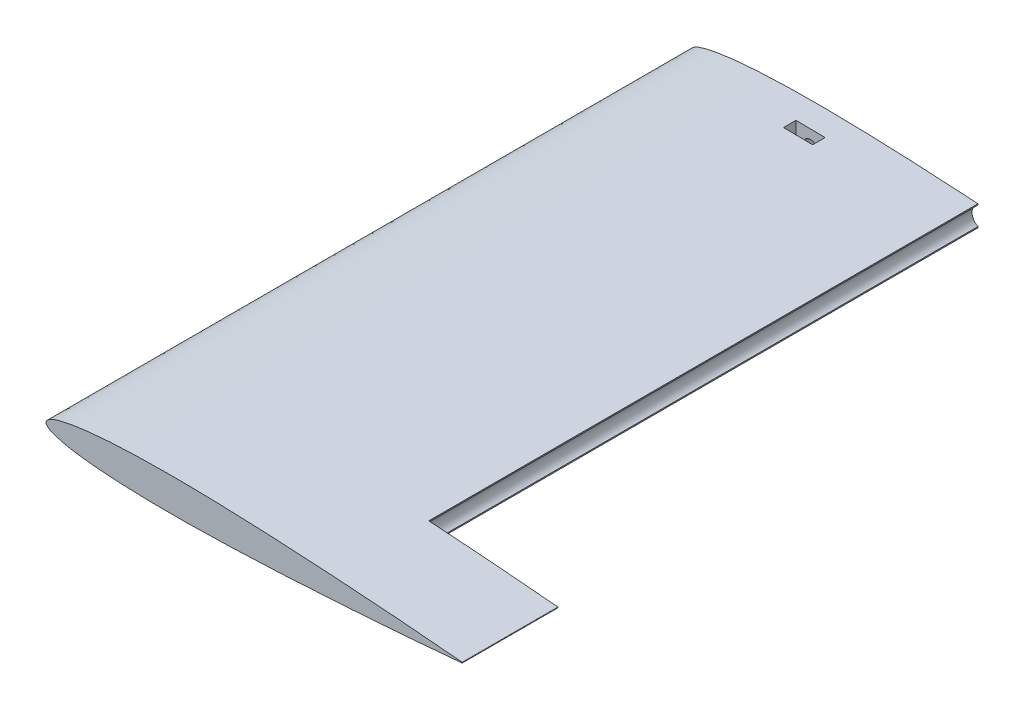
ISO-10303-21;
HEADER;
FILE_DESCRIPTION(('STEP AP214'),'2;1');
FILE_NAME('part.step','',(''),(''),'','','');
FILE_SCHEMA(('AUTOMOTIVE_DESIGN { 1 0 10303 214 1 1 1 1 }'));
ENDSEC;
DATA;
#1=APPLICATION_CONTEXT('core data for automotive mechanical design processes');
#2=APPLICATION_PROTOCOL_DEFINITION('international standard','automotive_design',2000,#1);
#3=PRODUCT_CONTEXT('',#1,'mechanical');
#4=PRODUCT('Part','Part','',(#3));
#5=PRODUCT_RELATED_PRODUCT_CATEGORY('part','',(#4));
#6=PRODUCT_DEFINITION_FORMATION('','',#4);
#7=PRODUCT_DEFINITION_CONTEXT('part definition',#1,'design');
#8=PRODUCT_DEFINITION('design','',#6,#7);
#9=PRODUCT_DEFINITION_SHAPE('','',#8);
#10=(LENGTH_UNIT() NAMED_UNIT(*) SI_UNIT(.MILLI.,.METRE.));
#11=(NAMED_UNIT(*) PLANE_ANGLE_UNIT() SI_UNIT($,.RADIAN.));
#12=(NAMED_UNIT(*) SI_UNIT($,.STERADIAN.) SOLID_ANGLE_UNIT());
#13=UNCERTAINTY_MEASURE_WITH_UNIT(LENGTH_MEASURE(1.E-05),#10,'distance_accuracy_value','');
#14=(GEOMETRIC_REPRESENTATION_CONTEXT(3) GLOBAL_UNCERTAINTY_ASSIGNED_CONTEXT((#13)) GLOBAL_UNIT_ASSIGNED_CONTEXT((#10,
#11,#12)) REPRESENTATION_CONTEXT('',''));
#15=CARTESIAN_POINT('',(0.,0.,0.));
#16=DIRECTION('',(0.,0.,1.));
#17=DIRECTION('',(1.,0.,0.));
#18=AXIS2_PLACEMENT_3D('',#15,#16,#17);
#19=CARTESIAN_POINT('',(100.,0.084,132.));
#20=CARTESIAN_POINT('',(98.333488814933,0.236746480055364,132.));
#21=CARTESIAN_POINT('',(95.0011947254255,0.542172688557606,132.));
#22=CARTESIAN_POINT('',(88.3355596211879,1.11089898015662,132.));
#23=CARTESIAN_POINT('',(80.0032933562199,1.76361099520967,132.));
#24=CARTESIAN_POINT('',(70.0029989334555,2.45786169254404,132.));
#25=CARTESIAN_POINT('',(60.0031046254057,3.06174772348002,132.));
#26=CARTESIAN_POINT('',(50.0030086005351,3.55213921170033,132.));
#27=CARTESIAN_POINT('',(40.0025985576922,3.90294649372571,132.));
#28=CARTESIAN_POINT('',(31.666961485844,4.02526015065941,132.));
#29=CARTESIAN_POINT('',(24.9991546003269,3.97693379087482,132.));
#30=CARTESIAN_POINT('',(19.9977755867835,3.84497639830756,132.));
#31=CARTESIAN_POINT('',(14.9933631314586,3.59248695861782,132.));
#32=CARTESIAN_POINT('',(10.8271840648808,3.23765157891607,132.));
#33=CARTESIAN_POINT('',(7.48905438800269,2.81402136675529,132.));
#34=CARTESIAN_POINT('',(4.99359465012965,2.40367305928858,132.));
#35=CARTESIAN_POINT('',(2.84962633983361,1.86792549429032,132.));
#36=CARTESIAN_POINT('',(1.16541350274339,1.32098725183071,132.));
#37=CARTESIAN_POINT('',(-0.664613784127027,0.,132.));
#38=CARTESIAN_POINT('',(1.16541350274339,-1.32098725183071,132.));
#39=CARTESIAN_POINT('',(2.84962633983362,-1.86792549429032,132.));
#40=CARTESIAN_POINT('',(4.99359465012963,-2.40367305928857,132.));
#41=CARTESIAN_POINT('',(7.48905438800269,-2.81402136675529,132.));
#42=CARTESIAN_POINT('',(10.8271840648809,-3.23765157891607,132.));
#43=CARTESIAN_POINT('',(14.9933631314586,-3.59248695861782,132.));
#44=CARTESIAN_POINT('',(19.9977755867835,-3.84497639830756,132.));
#45=CARTESIAN_POINT('',(24.9991546003269,-3.97693379087482,132.));
#46=CARTESIAN_POINT('',(31.666961485844,-4.02526015065941,132.));
#47=CARTESIAN_POINT('',(40.0025985576922,-3.90294649372571,132.));
#48=CARTESIAN_POINT('',(50.0030086005351,-3.55213921170033,132.));
#49=CARTESIAN_POINT('',(60.0031046254058,-3.06174772348002,132.));
#50=CARTESIAN_POINT('',(70.0029989334555,-2.45786169254404,132.));
#51=CARTESIAN_POINT('',(80.0032933562199,-1.76361099520967,132.));
#52=CARTESIAN_POINT('',(88.3355596211879,-1.11089898015662,132.));
#53=CARTESIAN_POINT('',(95.0011947254255,-0.542172688557605,132.));
#54=CARTESIAN_POINT('',(98.333488814933,-0.236746480055364,132.));
#55=CARTESIAN_POINT('',(100.,-0.084,132.));
#56=B_SPLINE_CURVE_WITH_KNOTS('',3,(#19,#20,#21,#22,#23,#24,#25,#26,#27,#28,#29,#30,#31,#32,#33,
#34,#35,#36,#37,#38,#39,#40,#41,#42,#43,#44,#45,#46,#47,#48,#49,#50,#51,#52,#53,#54,#55),
.UNSPECIFIED.,.F.,.F.,(4,1,1,1,1,1,1,1,1,1,1,1,1,1,1,1,1,1,1,1,1,1,1,1,1,1,1,1,1,1,1,1,1,1,4),
(0.,0.0248762929189861,0.0497417146704998,0.0994434021110951,0.149112224036195,
0.198750974066913,0.248359097492202,0.297937369716024,0.347491327096237,0.37226694027957,
0.39705092368842,0.421859474838904,0.446731345826762,0.459220451479859,0.471790601601357,
0.484560454432956,0.491195112481227,0.5,0.508804887518773,0.515439545567044,0.528209398398643,
0.540779548520141,0.553268654173238,0.578140525161096,0.60294907631158,0.62773305972043,
0.652508672903763,0.702062630283976,0.751640902507798,0.801249025933086,0.850887775963805,
0.900556597888905,0.9502582853295,0.975123707081014,1.),.UNSPECIFIED.);
#57=DIRECTION('',(0.,0.,-1.));
#58=VECTOR('',#57,1.);
#59=SURFACE_OF_LINEAR_EXTRUSION('',#56,#58);
#60=CARTESIAN_POINT('',(100.,0.084,0.));
#61=CARTESIAN_POINT('',(98.333488814933,0.236746480055364,0.));
#62=CARTESIAN_POINT('',(95.0011947254255,0.542172688557606,0.));
#63=CARTESIAN_POINT('',(88.3355596211879,1.11089898015662,0.));
#64=CARTESIAN_POINT('',(80.0032933562199,1.76361099520967,0.));
#65=CARTESIAN_POINT('',(70.0029989334555,2.45786169254404,0.));
#66=CARTESIAN_POINT('',(60.0031046254057,3.06174772348002,0.));
#67=CARTESIAN_POINT('',(50.0030086005351,3.55213921170033,0.));
#68=CARTESIAN_POINT('',(40.0025985576922,3.90294649372571,0.));
#69=CARTESIAN_POINT('',(31.666961485844,4.02526015065941,0.));
#70=CARTESIAN_POINT('',(24.9991546003269,3.97693379087482,0.));
#71=CARTESIAN_POINT('',(19.9977755867835,3.84497639830756,0.));
#72=CARTESIAN_POINT('',(14.9933631314586,3.59248695861782,0.));
#73=CARTESIAN_POINT('',(10.8271840648808,3.23765157891607,0.));
#74=CARTESIAN_POINT('',(7.48905438800269,2.81402136675529,0.));
#75=CARTESIAN_POINT('',(4.99359465012965,2.40367305928858,0.));
#76=CARTESIAN_POINT('',(2.84962633983361,1.86792549429032,0.));
#77=CARTESIAN_POINT('',(1.16541350274339,1.32098725183071,0.));
#78=CARTESIAN_POINT('',(-0.664613784127027,0.,0.));
#79=CARTESIAN_POINT('',(1.16541350274339,-1.32098725183071,0.));
#80=CARTESIAN_POINT('',(2.84962633983362,-1.86792549429032,0.));
#81=CARTESIAN_POINT('',(4.99359465012963,-2.40367305928857,0.));
#82=CARTESIAN_POINT('',(7.48905438800269,-2.81402136675529,0.));
#83=CARTESIAN_POINT('',(10.8271840648809,-3.23765157891607,0.));
#84=CARTESIAN_POINT('',(14.9933631314586,-3.59248695861782,0.));
#85=CARTESIAN_POINT('',(19.9977755867835,-3.84497639830756,0.));
#86=CARTESIAN_POINT('',(24.9991546003269,-3.97693379087482,0.));
#87=CARTESIAN_POINT('',(31.666961485844,-4.02526015065941,0.));
#88=CARTESIAN_POINT('',(40.0025985576922,-3.90294649372571,0.));
#89=CARTESIAN_POINT('',(50.0030086005351,-3.55213921170033,0.));
#90=CARTESIAN_POINT('',(60.0031046254058,-3.06174772348002,0.));
#91=CARTESIAN_POINT('',(70.0029989334555,-2.45786169254404,0.));
#92=CARTESIAN_POINT('',(80.0032933562199,-1.76361099520967,0.));
#93=CARTESIAN_POINT('',(88.3355596211879,-1.11089898015662,0.));
#94=CARTESIAN_POINT('',(95.0011947254255,-0.542172688557605,0.));
#95=CARTESIAN_POINT('',(98.333488814933,-0.236746480055364,0.));
#96=CARTESIAN_POINT('',(100.,-0.084,0.));
#97=B_SPLINE_CURVE_WITH_KNOTS('',3,(#60,#61,#62,#63,#64,#65,#66,#67,#68,#69,#70,#71,#72,#73,#74,
#75,#76,#77,#78,#79,#80,#81,#82,#83,#84,#85,#86,#87,#88,#89,#90,#91,#92,#93,#94,#95,#96),
.UNSPECIFIED.,.F.,.F.,(4,1,1,1,1,1,1,1,1,1,1,1,1,1,1,1,1,1,1,1,1,1,1,1,1,1,1,1,1,1,1,1,1,1,4),
(0.,0.0248762929189861,0.0497417146704998,0.0994434021110951,0.149112224036195,
0.198750974066913,0.248359097492202,0.297937369716024,0.347491327096237,0.37226694027957,
0.39705092368842,0.421859474838904,0.446731345826762,0.459220451479859,0.471790601601357,
0.484560454432956,0.491195112481227,0.5,0.508804887518773,0.515439545567044,0.528209398398643,
0.540779548520141,0.553268654173238,0.578140525161096,0.60294907631158,0.62773305972043,
0.652508672903763,0.702062630283976,0.751640902507798,0.801249025933086,0.850887775963805,
0.900556597888905,0.9502582853295,0.975123707081014,1.),.UNSPECIFIED.);
#98=CARTESIAN_POINT('',(68.9999999999599,2.50744788018033,0.));
#99=VERTEX_POINT('',#98);
#100=CARTESIAN_POINT('',(68.9999999766901,-2.50744788166933,0.));
#101=VERTEX_POINT('',#100);
#102=EDGE_CURVE('E235',#99,#101,#97,.T.);
#103=ORIENTED_EDGE('',*,*,#102,.T.);
#104=DIRECTION('',(0.,0.,-1.));
#105=VECTOR('',#104,1.);
#106=CARTESIAN_POINT('',(68.9999999999599,-2.50744788017844,137.843729929357));
#107=LINE('',#106,#105);
#108=CARTESIAN_POINT('',(68.9999999999599,-2.50744788017844,132.));
#109=VERTEX_POINT('',#108);
#110=EDGE_CURVE('E199',#109,#101,#107,.T.);
#111=ORIENTED_EDGE('',*,*,#110,.F.);
#112=CARTESIAN_POINT('',(100.,0.084,132.));
#113=CARTESIAN_POINT('',(98.333488814933,0.236746480055364,132.));
#114=CARTESIAN_POINT('',(95.0011947254255,0.542172688557606,132.));
#115=CARTESIAN_POINT('',(88.3355596211879,1.11089898015662,132.));
#116=CARTESIAN_POINT('',(80.0032933562199,1.76361099520967,132.));
#117=CARTESIAN_POINT('',(70.0029989334555,2.45786169254404,132.));
#118=CARTESIAN_POINT('',(60.0031046254057,3.06174772348002,132.));
#119=CARTESIAN_POINT('',(50.0030086005351,3.55213921170033,132.));
#120=CARTESIAN_POINT('',(40.0025985576922,3.90294649372571,132.));
#121=CARTESIAN_POINT('',(31.666961485844,4.02526015065941,132.));
#122=CARTESIAN_POINT('',(24.9991546003269,3.97693379087482,132.));
#123=CARTESIAN_POINT('',(19.9977755867835,3.84497639830756,132.));
#124=CARTESIAN_POINT('',(14.9933631314586,3.59248695861782,132.));
#125=CARTESIAN_POINT('',(10.8271840648808,3.23765157891607,132.));
#126=CARTESIAN_POINT('',(7.48905438800269,2.81402136675529,132.));
#127=CARTESIAN_POINT('',(4.99359465012965,2.40367305928858,132.));
#128=CARTESIAN_POINT('',(2.84962633983361,1.86792549429032,132.));
#129=CARTESIAN_POINT('',(1.16541350274339,1.32098725183071,132.));
#130=CARTESIAN_POINT('',(-0.664613784127027,0.,132.));
#131=CARTESIAN_POINT('',(1.16541350274339,-1.32098725183071,132.));
#132=CARTESIAN_POINT('',(2.84962633983362,-1.86792549429032,132.));
#133=CARTESIAN_POINT('',(4.99359465012963,-2.40367305928857,132.));
#134=CARTESIAN_POINT('',(7.48905438800269,-2.81402136675529,132.));
#135=CARTESIAN_POINT('',(10.8271840648809,-3.23765157891607,132.));
#136=CARTESIAN_POINT('',(14.9933631314586,-3.59248695861782,132.));
#137=CARTESIAN_POINT('',(19.9977755867835,-3.84497639830756,132.));
#138=CARTESIAN_POINT('',(24.9991546003269,-3.97693379087482,132.));
#139=CARTESIAN_POINT('',(31.666961485844,-4.02526015065941,132.));
#140=CARTESIAN_POINT('',(40.0025985576922,-3.90294649372571,132.));
#141=CARTESIAN_POINT('',(50.0030086005351,-3.55213921170033,132.));
#142=CARTESIAN_POINT('',(60.0031046254058,-3.06174772348002,132.));
#143=CARTESIAN_POINT('',(70.0029989334555,-2.45786169254404,132.));
#144=CARTESIAN_POINT('',(80.0032933562199,-1.76361099520967,132.));
#145=CARTESIAN_POINT('',(88.3355596211879,-1.11089898015662,132.));
#146=CARTESIAN_POINT('',(95.0011947254255,-0.542172688557605,132.));
#147=CARTESIAN_POINT('',(98.333488814933,-0.236746480055364,132.));
#148=CARTESIAN_POINT('',(100.,-0.084,132.));
#149=B_SPLINE_CURVE_WITH_KNOTS('',3,(#112,#113,#114,#115,#116,#117,#118,#119,#120,#121,#122,
#123,#124,#125,#126,#127,#128,#129,#130,#131,#132,#133,#134,#135,#136,#137,#138,#139,#140,#141,
#142,#143,#144,#145,#146,#147,#148),.UNSPECIFIED.,.F.,.F.,(4,1,1,1,1,1,1,1,1,1,1,1,1,1,1,1,1,1,
1,1,1,1,1,1,1,1,1,1,1,1,1,1,1,1,4),(0.,0.0248762929189861,0.0497417146704998,0.0994434021110951,
0.149112224036195,0.198750974066913,0.248359097492202,0.297937369716024,0.347491327096237,
0.37226694027957,0.39705092368842,0.421859474838904,0.446731345826762,0.459220451479859,
0.471790601601357,0.484560454432956,0.491195112481227,0.5,0.508804887518773,0.515439545567044,
0.528209398398643,0.540779548520141,0.553268654173238,0.578140525161096,0.60294907631158,
0.62773305972043,0.652508672903763,0.702062630283976,0.751640902507798,0.801249025933086,
0.850887775963805,0.900556597888905,0.9502582853295,0.975123707081014,1.),.UNSPECIFIED.);
#150=CARTESIAN_POINT('',(100.,-0.084,132.));
#151=VERTEX_POINT('',#150);
#152=EDGE_CURVE('E210',#109,#151,#149,.T.);
#153=ORIENTED_EDGE('',*,*,#152,.T.);
#154=DIRECTION('',(0.,0.,-1.));
#155=VECTOR('',#154,1.);
#156=CARTESIAN_POINT('',(100.,-0.084,155.));
#157=LINE('',#156,#155);
#158=CARTESIAN_POINT('',(100.,-0.084,155.));
#159=VERTEX_POINT('',#158);
#160=EDGE_CURVE('E233',#159,#151,#157,.T.);
#161=ORIENTED_EDGE('',*,*,#160,.F.);
#162=CARTESIAN_POINT('',(100.,0.084,155.));
#163=CARTESIAN_POINT('',(98.333488814933,0.236746480055364,155.));
#164=CARTESIAN_POINT('',(95.0011947254255,0.542172688557606,155.));
#165=CARTESIAN_POINT('',(88.3355596211879,1.11089898015662,155.));
#166=CARTESIAN_POINT('',(80.0032933562199,1.76361099520967,155.));
#167=CARTESIAN_POINT('',(70.0029989334555,2.45786169254404,155.));
#168=CARTESIAN_POINT('',(60.0031046254057,3.06174772348002,155.));
#169=CARTESIAN_POINT('',(50.0030086005351,3.55213921170033,155.));
#170=CARTESIAN_POINT('',(40.0025985576922,3.90294649372571,155.));
#171=CARTESIAN_POINT('',(31.666961485844,4.02526015065941,155.));
#172=CARTESIAN_POINT('',(24.9991546003269,3.97693379087482,155.));
#173=CARTESIAN_POINT('',(19.9977755867835,3.84497639830756,155.));
#174=CARTESIAN_POINT('',(14.9933631314586,3.59248695861782,155.));
#175=CARTESIAN_POINT('',(10.8271840648808,3.23765157891607,155.));
#176=CARTESIAN_POINT('',(7.48905438800269,2.81402136675529,155.));
#177=CARTESIAN_POINT('',(4.99359465012965,2.40367305928858,155.));
#178=CARTESIAN_POINT('',(2.84962633983361,1.86792549429032,155.));
#179=CARTESIAN_POINT('',(1.16541350274339,1.32098725183071,155.));
#180=CARTESIAN_POINT('',(-0.664613784127027,0.,155.));
#181=CARTESIAN_POINT('',(1.16541350274339,-1.32098725183071,155.));
#182=CARTESIAN_POINT('',(2.84962633983362,-1.86792549429032,155.));
#183=CARTESIAN_POINT('',(4.99359465012963,-2.40367305928857,155.));
#184=CARTESIAN_POINT('',(7.48905438800269,-2.81402136675529,155.));
#185=CARTESIAN_POINT('',(10.8271840648809,-3.23765157891607,155.));
#186=CARTESIAN_POINT('',(14.9933631314586,-3.59248695861782,155.));
#187=CARTESIAN_POINT('',(19.9977755867835,-3.84497639830756,155.));
#188=CARTESIAN_POINT('',(24.9991546003269,-3.97693379087482,155.));
#189=CARTESIAN_POINT('',(31.666961485844,-4.02526015065941,155.));
#190=CARTESIAN_POINT('',(40.0025985576922,-3.90294649372571,155.));
#191=CARTESIAN_POINT('',(50.0030086005351,-3.55213921170033,155.));
#192=CARTESIAN_POINT('',(60.0031046254058,-3.06174772348002,155.));
#193=CARTESIAN_POINT('',(70.0029989334555,-2.45786169254404,155.));
#194=CARTESIAN_POINT('',(80.0032933562199,-1.76361099520967,155.));
#195=CARTESIAN_POINT('',(88.3355596211879,-1.11089898015662,155.));
#196=CARTESIAN_POINT('',(95.0011947254255,-0.542172688557605,155.));
#197=CARTESIAN_POINT('',(98.333488814933,-0.236746480055364,155.));
#198=CARTESIAN_POINT('',(100.,-0.084,155.));
#199=B_SPLINE_CURVE_WITH_KNOTS('',3,(#162,#163,#164,#165,#166,#167,#168,#169,#170,#171,#172,
#173,#174,#175,#176,#177,#178,#179,#180,#181,#182,#183,#184,#185,#186,#187,#188,#189,#190,#191,
#192,#193,#194,#195,#196,#197,#198),.UNSPECIFIED.,.F.,.F.,(4,1,1,1,1,1,1,1,1,1,1,1,1,1,1,1,1,1,
1,1,1,1,1,1,1,1,1,1,1,1,1,1,1,1,4),(0.,0.0248762929189861,0.0497417146704998,0.0994434021110951,
0.149112224036195,0.198750974066913,0.248359097492202,0.297937369716024,0.347491327096237,
0.37226694027957,0.39705092368842,0.421859474838904,0.446731345826762,0.459220451479859,
0.471790601601357,0.484560454432956,0.491195112481227,0.5,0.508804887518773,0.515439545567044,
0.528209398398643,0.540779548520141,0.553268654173238,0.578140525161096,0.60294907631158,
0.62773305972043,0.652508672903763,0.702062630283976,0.751640902507798,0.801249025933086,
0.850887775963805,0.900556597888905,0.9502582853295,0.975123707081014,1.),.UNSPECIFIED.);
#200=CARTESIAN_POINT('',(100.,0.084,155.));
#201=VERTEX_POINT('',#200);
#202=EDGE_CURVE('E211',#201,#159,#199,.T.);
#203=ORIENTED_EDGE('',*,*,#202,.F.);
#204=DIRECTION('',(0.,0.,-1.));
#205=VECTOR('',#204,1.);
#206=CARTESIAN_POINT('',(100.,0.084,155.));
#207=LINE('',#206,#205);
#208=CARTESIAN_POINT('',(100.,0.084,132.));
#209=VERTEX_POINT('',#208);
#210=EDGE_CURVE('E222',#201,#209,#207,.T.);
#211=ORIENTED_EDGE('',*,*,#210,.T.);
#212=CARTESIAN_POINT('',(68.9999999999599,2.50744788018033,132.));
#213=VERTEX_POINT('',#212);
#214=EDGE_CURVE('E223',#209,#213,#149,.T.);
#215=ORIENTED_EDGE('',*,*,#214,.T.);
#216=DIRECTION('',(0.,0.,-1.));
#217=VECTOR('',#216,1.);
#218=CARTESIAN_POINT('',(68.9999999999599,2.50744788018033,137.843729929357));
#219=LINE('',#218,#217);
#220=EDGE_CURVE('E200',#213,#99,#219,.T.);
#221=ORIENTED_EDGE('',*,*,#220,.T.);
#222=EDGE_LOOP('',(#103,#111,#153,#161,#203,#211,#215,#221));
#223=FACE_BOUND('',#222,.T.);
#224=CARTESIAN_POINT('',(100.,0.084,9.00000000000001));
#225=CARTESIAN_POINT('',(98.333488814933,0.236746480055364,9.00000000000001));
#226=CARTESIAN_POINT('',(95.0011947254255,0.542172688557606,9.00000000000001));
#227=CARTESIAN_POINT('',(88.3355596211879,1.11089898015662,9.00000000000001));
#228=CARTESIAN_POINT('',(80.0032933562199,1.76361099520967,9.00000000000001));
#229=CARTESIAN_POINT('',(70.0029989334555,2.45786169254404,9.00000000000001));
#230=CARTESIAN_POINT('',(60.0031046254057,3.06174772348002,9.00000000000001));
#231=CARTESIAN_POINT('',(50.0030086005351,3.55213921170033,9.00000000000001));
#232=CARTESIAN_POINT('',(40.0025985576922,3.90294649372571,9.00000000000001));
#233=CARTESIAN_POINT('',(31.666961485844,4.02526015065941,9.00000000000001));
#234=CARTESIAN_POINT('',(24.9991546003269,3.97693379087482,9.00000000000001));
#235=CARTESIAN_POINT('',(19.9977755867835,3.84497639830756,9.00000000000001));
#236=CARTESIAN_POINT('',(14.9933631314586,3.59248695861782,9.00000000000001));
#237=CARTESIAN_POINT('',(10.8271840648808,3.23765157891607,9.00000000000001));
#238=CARTESIAN_POINT('',(7.48905438800269,2.81402136675529,9.00000000000001));
#239=CARTESIAN_POINT('',(4.99359465012965,2.40367305928858,9.00000000000001));
#240=CARTESIAN_POINT('',(2.84962633983361,1.86792549429032,9.00000000000001));
#241=CARTESIAN_POINT('',(1.16541350274339,1.32098725183071,9.00000000000001));
#242=CARTESIAN_POINT('',(-0.664613784127027,0.,9.00000000000001));
#243=CARTESIAN_POINT('',(1.16541350274339,-1.32098725183071,9.00000000000001));
#244=CARTESIAN_POINT('',(2.84962633983362,-1.86792549429032,9.00000000000001));
#245=CARTESIAN_POINT('',(4.99359465012963,-2.40367305928857,9.00000000000001));
#246=CARTESIAN_POINT('',(7.48905438800269,-2.81402136675529,9.00000000000001));
#247=CARTESIAN_POINT('',(10.8271840648809,-3.23765157891607,9.00000000000001));
#248=CARTESIAN_POINT('',(14.9933631314586,-3.59248695861782,9.00000000000001));
#249=CARTESIAN_POINT('',(19.9977755867835,-3.84497639830756,9.00000000000001));
#250=CARTESIAN_POINT('',(24.9991546003269,-3.97693379087482,9.00000000000001));
#251=CARTESIAN_POINT('',(31.666961485844,-4.02526015065941,9.00000000000001));
#252=CARTESIAN_POINT('',(40.0025985576922,-3.90294649372571,9.00000000000001));
#253=CARTESIAN_POINT('',(50.0030086005351,-3.55213921170033,9.00000000000001));
#254=CARTESIAN_POINT('',(60.0031046254058,-3.06174772348002,9.00000000000001));
#255=CARTESIAN_POINT('',(70.0029989334555,-2.45786169254404,9.00000000000001));
#256=CARTESIAN_POINT('',(80.0032933562199,-1.76361099520967,9.00000000000001));
#257=CARTESIAN_POINT('',(88.3355596211879,-1.11089898015662,9.00000000000001));
#258=CARTESIAN_POINT('',(95.0011947254255,-0.542172688557605,9.00000000000001));
#259=CARTESIAN_POINT('',(98.333488814933,-0.236746480055364,9.00000000000001));
#260=CARTESIAN_POINT('',(100.,-0.084,9.00000000000001));
#261=B_SPLINE_CURVE_WITH_KNOTS('',3,(#224,#225,#226,#227,#228,#229,#230,#231,#232,#233,#234,
#235,#236,#237,#238,#239,#240,#241,#242,#243,#244,#245,#246,#247,#248,#249,#250,#251,#252,#253,
#254,#255,#256,#257,#258,#259,#260),.UNSPECIFIED.,.F.,.F.,(4,1,1,1,1,1,1,1,1,1,1,1,1,1,1,1,1,1,
1,1,1,1,1,1,1,1,1,1,1,1,1,1,1,1,4),(0.,0.0248762929189861,0.0497417146704998,0.0994434021110951,
0.149112224036195,0.198750974066913,0.248359097492202,0.297937369716024,0.347491327096237,
0.37226694027957,0.39705092368842,0.421859474838904,0.446731345826762,0.459220451479859,
0.471790601601357,0.484560454432956,0.491195112481227,0.5,0.508804887518773,0.515439545567044,
0.528209398398643,0.540779548520141,0.553268654173238,0.578140525161096,0.60294907631158,
0.62773305972043,0.652508672903763,0.702062630283976,0.751640902507798,0.801249025933086,
0.850887775963805,0.900556597888905,0.9502582853295,0.975123707081014,1.),.UNSPECIFIED.);
#262=CARTESIAN_POINT('',(31.25,3.998671777626,9.));
#263=VERTEX_POINT('',#262);
#264=CARTESIAN_POINT('',(38.25,3.90932108761623,9.));
#265=VERTEX_POINT('',#264);
#266=EDGE_CURVE('E173',#263,#265,#261,.F.);
#267=ORIENTED_EDGE('',*,*,#266,.F.);
#268=DIRECTION('',(0.,0.,-1.));
#269=VECTOR('',#268,1.);
#270=CARTESIAN_POINT('',(31.25,3.998671777626,132.));
#271=LINE('',#270,#269);
#272=CARTESIAN_POINT('',(31.25,3.998671777626,6.));
#273=VERTEX_POINT('',#272);
#274=EDGE_CURVE('E11',#273,#263,#271,.F.);
#275=ORIENTED_EDGE('',*,*,#274,.F.);
#276=CARTESIAN_POINT('',(100.,0.084,6.00000000000001));
#277=CARTESIAN_POINT('',(98.333488814933,0.236746480055364,6.00000000000001));
#278=CARTESIAN_POINT('',(95.0011947254255,0.542172688557606,6.00000000000001));
#279=CARTESIAN_POINT('',(88.3355596211879,1.11089898015662,6.00000000000001));
#280=CARTESIAN_POINT('',(80.0032933562199,1.76361099520967,6.00000000000001));
#281=CARTESIAN_POINT('',(70.0029989334555,2.45786169254404,6.00000000000001));
#282=CARTESIAN_POINT('',(60.0031046254057,3.06174772348002,6.00000000000001));
#283=CARTESIAN_POINT('',(50.0030086005351,3.55213921170033,6.00000000000001));
#284=CARTESIAN_POINT('',(40.0025985576922,3.90294649372571,6.00000000000001));
#285=CARTESIAN_POINT('',(31.666961485844,4.02526015065941,6.00000000000001));
#286=CARTESIAN_POINT('',(24.9991546003269,3.97693379087482,6.00000000000001));
#287=CARTESIAN_POINT('',(19.9977755867835,3.84497639830756,6.00000000000001));
#288=CARTESIAN_POINT('',(14.9933631314586,3.59248695861782,6.00000000000001));
#289=CARTESIAN_POINT('',(10.8271840648808,3.23765157891607,6.00000000000001));
#290=CARTESIAN_POINT('',(7.48905438800269,2.81402136675529,6.00000000000001));
#291=CARTESIAN_POINT('',(4.99359465012965,2.40367305928858,6.00000000000001));
#292=CARTESIAN_POINT('',(2.84962633983361,1.86792549429032,6.00000000000001));
#293=CARTESIAN_POINT('',(1.16541350274339,1.32098725183071,6.00000000000001));
#294=CARTESIAN_POINT('',(-0.664613784127027,0.,6.00000000000001));
#295=CARTESIAN_POINT('',(1.16541350274339,-1.32098725183071,6.00000000000001));
#296=CARTESIAN_POINT('',(2.84962633983362,-1.86792549429032,6.00000000000001));
#297=CARTESIAN_POINT('',(4.99359465012963,-2.40367305928857,6.00000000000001));
#298=CARTESIAN_POINT('',(7.48905438800269,-2.81402136675529,6.00000000000001));
#299=CARTESIAN_POINT('',(10.8271840648809,-3.23765157891607,6.00000000000001));
#300=CARTESIAN_POINT('',(14.9933631314586,-3.59248695861782,6.00000000000001));
#301=CARTESIAN_POINT('',(19.9977755867835,-3.84497639830756,6.00000000000001));
#302=CARTESIAN_POINT('',(24.9991546003269,-3.97693379087482,6.00000000000001));
#303=CARTESIAN_POINT('',(31.666961485844,-4.02526015065941,6.00000000000001));
#304=CARTESIAN_POINT('',(40.0025985576922,-3.90294649372571,6.00000000000001));
#305=CARTESIAN_POINT('',(50.0030086005351,-3.55213921170033,6.00000000000001));
#306=CARTESIAN_POINT('',(60.0031046254058,-3.06174772348002,6.00000000000001));
#307=CARTESIAN_POINT('',(70.0029989334555,-2.45786169254404,6.00000000000001));
#308=CARTESIAN_POINT('',(80.0032933562199,-1.76361099520967,6.00000000000001));
#309=CARTESIAN_POINT('',(88.3355596211879,-1.11089898015662,6.00000000000001));
#310=CARTESIAN_POINT('',(95.0011947254255,-0.542172688557605,6.00000000000001));
#311=CARTESIAN_POINT('',(98.333488814933,-0.236746480055364,6.00000000000001));
#312=CARTESIAN_POINT('',(100.,-0.084,6.00000000000001));
#313=B_SPLINE_CURVE_WITH_KNOTS('',3,(#276,#277,#278,#279,#280,#281,#282,#283,#284,#285,#286,
#287,#288,#289,#290,#291,#292,#293,#294,#295,#296,#297,#298,#299,#300,#301,#302,#303,#304,#305,
#306,#307,#308,#309,#310,#311,#312),.UNSPECIFIED.,.F.,.F.,(4,1,1,1,1,1,1,1,1,1,1,1,1,1,1,1,1,1,
1,1,1,1,1,1,1,1,1,1,1,1,1,1,1,1,4),(0.,0.0248762929189861,0.0497417146704998,0.0994434021110951,
0.149112224036195,0.198750974066913,0.248359097492202,0.297937369716024,0.347491327096237,
0.37226694027957,0.39705092368842,0.421859474838904,0.446731345826762,0.459220451479859,
0.471790601601357,0.484560454432956,0.491195112481227,0.5,0.508804887518773,0.515439545567044,
0.528209398398643,0.540779548520141,0.553268654173238,0.578140525161096,0.60294907631158,
0.62773305972043,0.652508672903763,0.702062630283976,0.751640902507798,0.801249025933086,
0.850887775963805,0.900556597888905,0.9502582853295,0.975123707081014,1.),.UNSPECIFIED.);
#314=CARTESIAN_POINT('',(38.2499999999986,3.90932108761623,6.00000000000001));
#315=VERTEX_POINT('',#314);
#316=EDGE_CURVE('E167',#273,#315,#313,.F.);
#317=ORIENTED_EDGE('',*,*,#316,.T.);
#318=DIRECTION('',(0.,0.,-1.));
#319=VECTOR('',#318,1.);
#320=CARTESIAN_POINT('',(38.25,3.90932108761621,132.));
#321=LINE('',#320,#319);
#322=EDGE_CURVE('E40',#265,#315,#321,.T.);
#323=ORIENTED_EDGE('',*,*,#322,.F.);
#324=EDGE_LOOP('',(#267,#275,#317,#323));
#325=FACE_BOUND('',#324,.T.);
#326=ADVANCED_FACE('F32',(#223,#325),#59,.F.);
#327=CARTESIAN_POINT('',(71.,0.,0.));
#328=DIRECTION('',(0.,0.,1.));
#329=DIRECTION('',(1.,0.,0.));
#330=AXIS2_PLACEMENT_3D('',#327,#328,#329);
#331=CYLINDRICAL_SURFACE('',#330,1.5);
#332=CARTESIAN_POINT('',(71.,0.,132.));
#333=DIRECTION('',(0.,0.,-1.));
#334=DIRECTION('',(-1.,0.,0.));
#335=AXIS2_PLACEMENT_3D('',#332,#333,#334);
#336=CIRCLE('',#335,1.5);
#337=CARTESIAN_POINT('',(69.5,0.,132.));
#338=VERTEX_POINT('',#337);
#339=EDGE_CURVE('E187',#338,#338,#336,.T.);
#340=ORIENTED_EDGE('',*,*,#339,.T.);
#341=EDGE_LOOP('',(#340));
#342=FACE_BOUND('',#341,.T.);
#343=CARTESIAN_POINT('',(71.,0.,150.));
#344=DIRECTION('',(0.,0.,1.));
#345=DIRECTION('',(1.,0.,0.));
#346=AXIS2_PLACEMENT_3D('',#343,#344,#345);
#347=CIRCLE('',#346,1.5);
#348=CARTESIAN_POINT('',(72.5,0.,150.));
#349=VERTEX_POINT('',#348);
#350=EDGE_CURVE('E259',#349,#349,#347,.F.);
#351=ORIENTED_EDGE('',*,*,#350,.F.);
#352=EDGE_LOOP('',(#351));
#353=FACE_BOUND('',#352,.T.);
#354=ADVANCED_FACE('F292',(#342,#353),#331,.F.);
#355=CARTESIAN_POINT('',(25.,0.,0.));
#356=DIRECTION('',(0.,0.,1.));
#357=DIRECTION('',(1.,0.,0.));
#358=AXIS2_PLACEMENT_3D('',#355,#356,#357);
#359=CYLINDRICAL_SURFACE('',#358,3.);
#360=CARTESIAN_POINT('',(25.,0.,0.));
#361=DIRECTION('',(0.,0.,1.));
#362=DIRECTION('',(1.,0.,0.));
#363=AXIS2_PLACEMENT_3D('',#360,#361,#362);
#364=CIRCLE('',#363,3.);
#365=CARTESIAN_POINT('',(28.,0.,0.));
#366=VERTEX_POINT('',#365);
#367=EDGE_CURVE('E207',#366,#366,#364,.T.);
#368=ORIENTED_EDGE('',*,*,#367,.F.);
#369=EDGE_LOOP('',(#368));
#370=FACE_BOUND('',#369,.T.);
#371=CARTESIAN_POINT('',(25.,0.,150.));
#372=DIRECTION('',(0.,0.,1.));
#373=DIRECTION('',(1.,0.,0.));
#374=AXIS2_PLACEMENT_3D('',#371,#372,#373);
#375=CIRCLE('',#374,3.);
#376=CARTESIAN_POINT('',(28.,0.,150.));
#377=VERTEX_POINT('',#376);
#378=EDGE_CURVE('E246',#377,#377,#375,.F.);
#379=ORIENTED_EDGE('',*,*,#378,.F.);
#380=EDGE_LOOP('',(#379));
#381=FACE_BOUND('',#380,.T.);
#382=ADVANCED_FACE('F299',(#370,#381),#359,.F.);
#383=CARTESIAN_POINT('',(69.9999999999599,9.44990613538366E-13,132.));
#384=DIRECTION('',(0.,0.,-1.));
#385=DIRECTION('',(-1.,0.,0.));
#386=AXIS2_PLACEMENT_3D('',#383,#384,#385);
#387=CYLINDRICAL_SURFACE('',#386,2.44300000000355);
#388=CARTESIAN_POINT('',(69.9999999999599,9.44990613538366E-13,0.));
#389=DIRECTION('',(0.,0.,-1.));
#390=DIRECTION('',(-1.,0.,0.));
#391=AXIS2_PLACEMENT_3D('',#388,#389,#390);
#392=CIRCLE('',#391,2.44300000000355);
#393=CARTESIAN_POINT('',(68.9999999999599,-2.2289569309462,0.));
#394=VERTEX_POINT('',#393);
#395=CARTESIAN_POINT('',(68.9999999999599,2.22895693094809,0.));
#396=VERTEX_POINT('',#395);
#397=EDGE_CURVE('E247',#394,#396,#392,.T.);
#398=ORIENTED_EDGE('',*,*,#397,.T.);
#399=DIRECTION('',(0.,0.,-1.));
#400=VECTOR('',#399,1.);
#401=CARTESIAN_POINT('',(68.9999999999599,2.22895693094809,132.));
#402=LINE('',#401,#400);
#403=CARTESIAN_POINT('',(68.9999999999599,2.22895693094809,132.));
#404=VERTEX_POINT('',#403);
#405=EDGE_CURVE('E55',#396,#404,#402,.F.);
#406=ORIENTED_EDGE('',*,*,#405,.T.);
#407=CARTESIAN_POINT('',(69.9999999999599,9.44990613538366E-13,132.));
#408=DIRECTION('',(0.,0.,-1.));
#409=DIRECTION('',(-1.,0.,0.));
#410=AXIS2_PLACEMENT_3D('',#407,#408,#409);
#411=CIRCLE('',#410,2.44300000000355);
#412=CARTESIAN_POINT('',(68.9999999999599,-2.2289569309462,132.));
#413=VERTEX_POINT('',#412);
#414=EDGE_CURVE('E240',#413,#404,#411,.T.);
#415=ORIENTED_EDGE('',*,*,#414,.F.);
#416=DIRECTION('',(0.,0.,-1.));
#417=VECTOR('',#416,1.);
#418=CARTESIAN_POINT('',(68.9999999999599,-2.2289569309462,132.));
#419=LINE('',#418,#417);
#420=EDGE_CURVE('E195',#413,#394,#419,.T.);
#421=ORIENTED_EDGE('',*,*,#420,.T.);
#422=EDGE_LOOP('',(#398,#406,#415,#421));
#423=FACE_BOUND('',#422,.T.);
#424=ADVANCED_FACE('F316',(#423),#387,.F.);
#425=CARTESIAN_POINT('',(0.,0.,0.));
#426=DIRECTION('',(0.,0.,-1.));
#427=DIRECTION('',(-1.,0.,0.));
#428=AXIS2_PLACEMENT_3D('',#425,#426,#427);
#429=PLANE('',#428);
#430=CARTESIAN_POINT('',(34.75,0.,0.));
#431=DIRECTION('',(0.,0.,-1.));
#432=DIRECTION('',(-1.,0.,0.));
#433=AXIS2_PLACEMENT_3D('',#430,#431,#432);
#434=CIRCLE('',#433,1.75);
#435=CARTESIAN_POINT('',(33.,0.,0.));
#436=VERTEX_POINT('',#435);
#437=EDGE_CURVE('E180',#436,#436,#434,.T.);
#438=ORIENTED_EDGE('',*,*,#437,.F.);
#439=EDGE_LOOP('',(#438));
#440=FACE_BOUND('',#439,.T.);
#441=DIRECTION('',(0.,1.,0.));
#442=VECTOR('',#441,1.);
#443=CARTESIAN_POINT('',(68.9999999999599,2.50744788018033,0.));
#444=LINE('',#443,#442);
#445=EDGE_CURVE('E197',#101,#394,#444,.T.);
#446=ORIENTED_EDGE('',*,*,#445,.F.);
#447=ORIENTED_EDGE('',*,*,#102,.F.);
#448=EDGE_CURVE('E192',#396,#99,#444,.T.);
#449=ORIENTED_EDGE('',*,*,#448,.F.);
#450=ORIENTED_EDGE('',*,*,#397,.F.);
#451=EDGE_LOOP('',(#446,#447,#449,#450));
#452=FACE_BOUND('',#451,.T.);
#453=ORIENTED_EDGE('',*,*,#367,.T.);
#454=EDGE_LOOP('',(#453));
#455=FACE_BOUND('',#454,.T.);
#456=ADVANCED_FACE('F307',(#440,#452,#455),#429,.T.);
#457=CARTESIAN_POINT('',(0.,0.,132.));
#458=DIRECTION('',(0.,0.,-1.));
#459=DIRECTION('',(-1.,0.,0.));
#460=AXIS2_PLACEMENT_3D('',#457,#458,#459);
#461=PLANE('',#460);
#462=ORIENTED_EDGE('',*,*,#339,.F.);
#463=EDGE_LOOP('',(#462));
#464=FACE_BOUND('',#463,.T.);
#465=ORIENTED_EDGE('',*,*,#414,.T.);
#466=DIRECTION('',(0.,-1.,0.));
#467=VECTOR('',#466,1.);
#468=CARTESIAN_POINT('',(68.9999999999599,2.50744788018033,132.));
#469=LINE('',#468,#467);
#470=EDGE_CURVE('E193',#213,#404,#469,.T.);
#471=ORIENTED_EDGE('',*,*,#470,.F.);
#472=ORIENTED_EDGE('',*,*,#214,.F.);
#473=CARTESIAN_POINT('',(100.,0.,132.));
#474=DIRECTION('',(0.,0.,1.));
#475=DIRECTION('',(-1.,0.,0.));
#476=AXIS2_PLACEMENT_3D('',#473,#474,#475);
#477=CIRCLE('',#476,0.084);
#478=EDGE_CURVE('E217',#151,#209,#477,.T.);
#479=ORIENTED_EDGE('',*,*,#478,.F.);
#480=ORIENTED_EDGE('',*,*,#152,.F.);
#481=EDGE_CURVE('E196',#413,#109,#469,.T.);
#482=ORIENTED_EDGE('',*,*,#481,.F.);
#483=EDGE_LOOP('',(#465,#471,#472,#479,#480,#482));
#484=FACE_BOUND('',#483,.T.);
#485=ADVANCED_FACE('F319',(#464,#484),#461,.T.);
#486=CARTESIAN_POINT('',(100.,0.,155.));
#487=DIRECTION('',(0.,0.,-1.));
#488=DIRECTION('',(-1.,0.,0.));
#489=AXIS2_PLACEMENT_3D('',#486,#487,#488);
#490=CYLINDRICAL_SURFACE('',#489,0.084);
#491=ORIENTED_EDGE('',*,*,#478,.T.);
#492=ORIENTED_EDGE('',*,*,#210,.F.);
#493=CARTESIAN_POINT('',(100.,0.,155.));
#494=DIRECTION('',(0.,0.,1.));
#495=DIRECTION('',(-1.,0.,0.));
#496=AXIS2_PLACEMENT_3D('',#493,#494,#495);
#497=CIRCLE('',#496,0.084);
#498=EDGE_CURVE('E216',#159,#201,#497,.T.);
#499=ORIENTED_EDGE('',*,*,#498,.F.);
#500=ORIENTED_EDGE('',*,*,#160,.T.);
#501=EDGE_LOOP('',(#491,#492,#499,#500));
#502=FACE_BOUND('',#501,.T.);
#503=ADVANCED_FACE('F325',(#502),#490,.T.);
#504=CARTESIAN_POINT('',(0.,0.,155.));
#505=DIRECTION('',(0.,0.,-1.));
#506=DIRECTION('',(-1.,0.,0.));
#507=AXIS2_PLACEMENT_3D('',#504,#505,#506);
#508=PLANE('',#507);
#509=ORIENTED_EDGE('',*,*,#202,.T.);
#510=ORIENTED_EDGE('',*,*,#498,.T.);
#511=EDGE_LOOP('',(#509,#510));
#512=FACE_BOUND('',#511,.T.);
#513=ADVANCED_FACE('F328',(#512),#508,.F.);
#514=CARTESIAN_POINT('',(68.9999999999599,2.50744788018033,137.843729929357));
#515=DIRECTION('',(-1.,0.,0.));
#516=DIRECTION('',(0.,0.,1.));
#517=AXIS2_PLACEMENT_3D('',#514,#515,#516);
#518=PLANE('',#517);
#519=ORIENTED_EDGE('',*,*,#448,.T.);
#520=ORIENTED_EDGE('',*,*,#220,.F.);
#521=ORIENTED_EDGE('',*,*,#470,.T.);
#522=ORIENTED_EDGE('',*,*,#405,.F.);
#523=EDGE_LOOP('',(#519,#520,#521,#522));
#524=FACE_BOUND('',#523,.T.);
#525=ADVANCED_FACE('F330',(#524),#518,.F.);
#526=ORIENTED_EDGE('',*,*,#481,.T.);
#527=ORIENTED_EDGE('',*,*,#110,.T.);
#528=ORIENTED_EDGE('',*,*,#445,.T.);
#529=ORIENTED_EDGE('',*,*,#420,.F.);
#530=EDGE_LOOP('',(#526,#527,#528,#529));
#531=FACE_BOUND('',#530,.T.);
#532=ADVANCED_FACE('F312',(#531),#518,.F.);
#533=CARTESIAN_POINT('',(25.,0.,150.));
#534=DIRECTION('',(0.,0.,1.));
#535=DIRECTION('',(1.,0.,0.));
#536=AXIS2_PLACEMENT_3D('',#533,#534,#535);
#537=PLANE('',#536);
#538=ORIENTED_EDGE('',*,*,#378,.T.);
#539=EDGE_LOOP('',(#538));
#540=FACE_BOUND('',#539,.T.);
#541=ADVANCED_FACE('F357',(#540),#537,.F.);
#542=CARTESIAN_POINT('',(71.,0.,150.));
#543=DIRECTION('',(0.,0.,1.));
#544=DIRECTION('',(1.,0.,0.));
#545=AXIS2_PLACEMENT_3D('',#542,#543,#544);
#546=PLANE('',#545);
#547=ORIENTED_EDGE('',*,*,#350,.T.);
#548=EDGE_LOOP('',(#547));
#549=FACE_BOUND('',#548,.T.);
#550=ADVANCED_FACE('F359',(#549),#546,.F.);
#551=CARTESIAN_POINT('',(34.75,0.,13.));
#552=DIRECTION('',(0.,0.,-1.));
#553=DIRECTION('',(-1.,0.,0.));
#554=AXIS2_PLACEMENT_3D('',#551,#552,#553);
#555=CYLINDRICAL_SURFACE('',#554,1.75);
#556=CARTESIAN_POINT('',(34.75,0.,6.));
#557=DIRECTION('',(0.,0.,-1.));
#558=DIRECTION('',(-1.,0.,0.));
#559=AXIS2_PLACEMENT_3D('',#556,#557,#558);
#560=CIRCLE('',#559,1.75);
#561=CARTESIAN_POINT('',(33.,0.,6.));
#562=VERTEX_POINT('',#561);
#563=EDGE_CURVE('E137',#562,#562,#560,.F.);
#564=CARTESIAN_POINT('',(33.,0.,6.));
#565=CARTESIAN_POINT('',(33.,0.,5.9375));
#566=CARTESIAN_POINT('',(33.,0.,5.875));
#567=CARTESIAN_POINT('',(33.,0.,5.75));
#568=CARTESIAN_POINT('',(33.,0.,5.6875));
#569=CARTESIAN_POINT('',(33.,0.,5.5625));
#570=CARTESIAN_POINT('',(33.,0.,5.5));
#571=CARTESIAN_POINT('',(33.,0.,5.375));
#572=CARTESIAN_POINT('',(33.,0.,5.3125));
#573=CARTESIAN_POINT('',(33.,0.,5.1875));
#574=CARTESIAN_POINT('',(33.,0.,5.125));
#575=CARTESIAN_POINT('',(33.,0.,5.));
#576=CARTESIAN_POINT('',(33.,0.,4.9375));
#577=CARTESIAN_POINT('',(33.,0.,4.8125));
#578=CARTESIAN_POINT('',(33.,0.,4.75));
#579=CARTESIAN_POINT('',(33.,0.,4.625));
#580=CARTESIAN_POINT('',(33.,0.,4.5625));
#581=CARTESIAN_POINT('',(33.,0.,4.4375));
#582=CARTESIAN_POINT('',(33.,0.,4.375));
#583=CARTESIAN_POINT('',(33.,0.,4.25));
#584=CARTESIAN_POINT('',(33.,0.,4.1875));
#585=CARTESIAN_POINT('',(33.,0.,4.0625));
#586=CARTESIAN_POINT('',(33.,0.,4.));
#587=CARTESIAN_POINT('',(33.,0.,3.875));
#588=CARTESIAN_POINT('',(33.,0.,3.8125));
#589=CARTESIAN_POINT('',(33.,0.,3.6875));
#590=CARTESIAN_POINT('',(33.,0.,3.625));
#591=CARTESIAN_POINT('',(33.,0.,3.5));
#592=CARTESIAN_POINT('',(33.,0.,3.4375));
#593=CARTESIAN_POINT('',(33.,0.,3.3125));
#594=CARTESIAN_POINT('',(33.,0.,3.25));
#595=CARTESIAN_POINT('',(33.,0.,3.125));
#596=CARTESIAN_POINT('',(33.,0.,3.0625));
#597=CARTESIAN_POINT('',(33.,0.,2.9375));
#598=CARTESIAN_POINT('',(33.,0.,2.875));
#599=CARTESIAN_POINT('',(33.,0.,2.75));
#600=CARTESIAN_POINT('',(33.,0.,2.6875));
#601=CARTESIAN_POINT('',(33.,0.,2.5625));
#602=CARTESIAN_POINT('',(33.,0.,2.5));
#603=CARTESIAN_POINT('',(33.,0.,2.375));
#604=CARTESIAN_POINT('',(33.,0.,2.3125));
#605=CARTESIAN_POINT('',(33.,0.,2.1875));
#606=CARTESIAN_POINT('',(33.,0.,2.125));
#607=CARTESIAN_POINT('',(33.,0.,2.));
#608=CARTESIAN_POINT('',(33.,0.,1.9375));
#609=CARTESIAN_POINT('',(33.,0.,1.8125));
#610=CARTESIAN_POINT('',(33.,0.,1.75));
#611=CARTESIAN_POINT('',(33.,0.,1.625));
#612=CARTESIAN_POINT('',(33.,0.,1.5625));
#613=CARTESIAN_POINT('',(33.,0.,1.4375));
#614=CARTESIAN_POINT('',(33.,0.,1.375));
#615=CARTESIAN_POINT('',(33.,0.,1.25));
#616=CARTESIAN_POINT('',(33.,0.,1.1875));
#617=CARTESIAN_POINT('',(33.,0.,1.0625));
#618=CARTESIAN_POINT('',(33.,0.,1.));
#619=CARTESIAN_POINT('',(33.,0.,0.875000000000001));
#620=CARTESIAN_POINT('',(33.,0.,0.812500000000001));
#621=CARTESIAN_POINT('',(33.,0.,0.687500000000001));
#622=CARTESIAN_POINT('',(33.,0.,0.625000000000001));
#623=CARTESIAN_POINT('',(33.,0.,0.5));
#624=CARTESIAN_POINT('',(33.,0.,0.4375));
#625=CARTESIAN_POINT('',(33.,0.,0.3125));
#626=CARTESIAN_POINT('',(33.,0.,0.25));
#627=CARTESIAN_POINT('',(33.,0.,0.125));
#628=CARTESIAN_POINT('',(33.,0.,0.0625000000000001));
#629=CARTESIAN_POINT('',(33.,0.,0.));
#630=B_SPLINE_CURVE_WITH_KNOTS('',3,(#564,#565,#566,#567,#568,#569,#570,#571,#572,#573,#574,
#575,#576,#577,#578,#579,#580,#581,#582,#583,#584,#585,#586,#587,#588,#589,#590,#591,#592,#593,
#594,#595,#596,#597,#598,#599,#600,#601,#602,#603,#604,#605,#606,#607,#608,#609,#610,#611,#612,
#613,#614,#615,#616,#617,#618,#619,#620,#621,#622,#623,#624,#625,#626,#627,#628,#629),
.UNSPECIFIED.,.F.,.F.,(4,2,2,2,2,2,2,2,2,2,2,2,2,2,2,2,2,2,2,2,2,2,2,2,2,2,2,2,2,2,2,2,4),(0.,
0.1875,0.375,0.5625,0.750000000000001,0.9375,1.125,1.3125,1.5,1.6875,1.875,2.0625,2.25,2.4375,
2.625,2.8125,3.,3.1875,3.375,3.5625,3.75,3.9375,4.125,4.3125,4.5,4.6875,4.875,5.0625,5.25,
5.4375,5.625,5.8125,6.),.UNSPECIFIED.);
#631=EDGE_CURVE('BSEAM365',#562,#436,#630,.T.);
#632=ORIENTED_EDGE('',*,*,#563,.T.);
#633=ORIENTED_EDGE('',*,*,#437,.T.);
#634=ORIENTED_EDGE('',*,*,#631,.T.);
#635=ORIENTED_EDGE('',*,*,#631,.F.);
#636=EDGE_LOOP('',(#632,#634,#633,#635));
#637=FACE_BOUND('',#636,.T.);
#638=ADVANCED_FACE('F365',(#637),#555,.F.);
#639=CARTESIAN_POINT('',(31.25,0.,9.));
#640=DIRECTION('',(1.,0.,0.));
#641=DIRECTION('',(0.,0.,-1.));
#642=AXIS2_PLACEMENT_3D('',#639,#640,#641);
#643=PLANE('',#642);
#644=ORIENTED_EDGE('',*,*,#274,.T.);
#645=DIRECTION('',(0.,-1.,0.));
#646=VECTOR('',#645,1.);
#647=CARTESIAN_POINT('',(31.25,0.,9.));
#648=LINE('',#647,#646);
#649=CARTESIAN_POINT('',(31.25,0.,9.));
#650=VERTEX_POINT('',#649);
#651=EDGE_CURVE('E120',#263,#650,#648,.T.);
#652=ORIENTED_EDGE('',*,*,#651,.T.);
#653=DIRECTION('',(0.,0.,-1.));
#654=VECTOR('',#653,1.);
#655=CARTESIAN_POINT('',(31.25,0.,9.));
#656=LINE('',#655,#654);
#657=CARTESIAN_POINT('',(31.25,0.,6.));
#658=VERTEX_POINT('',#657);
#659=EDGE_CURVE('E124',#650,#658,#656,.T.);
#660=ORIENTED_EDGE('',*,*,#659,.T.);
#661=DIRECTION('',(0.,-1.,0.));
#662=VECTOR('',#661,1.);
#663=CARTESIAN_POINT('',(31.25,0.,6.));
#664=LINE('',#663,#662);
#665=EDGE_CURVE('E153',#273,#658,#664,.T.);
#666=ORIENTED_EDGE('',*,*,#665,.F.);
#667=EDGE_LOOP('',(#644,#652,#660,#666));
#668=FACE_BOUND('',#667,.T.);
#669=ADVANCED_FACE('F122',(#668),#643,.T.);
#670=CARTESIAN_POINT('',(38.25,7.70515083495374,9.));
#671=DIRECTION('',(-1.,0.,0.));
#672=DIRECTION('',(0.,0.,1.));
#673=AXIS2_PLACEMENT_3D('',#670,#671,#672);
#674=PLANE('',#673);
#675=ORIENTED_EDGE('',*,*,#322,.T.);
#676=DIRECTION('',(0.,1.,0.));
#677=VECTOR('',#676,1.);
#678=CARTESIAN_POINT('',(38.25,7.70515083495374,6.));
#679=LINE('',#678,#677);
#680=CARTESIAN_POINT('',(38.25,0.,6.));
#681=VERTEX_POINT('',#680);
#682=EDGE_CURVE('E47',#681,#315,#679,.T.);
#683=ORIENTED_EDGE('',*,*,#682,.F.);
#684=DIRECTION('',(0.,0.,-1.));
#685=VECTOR('',#684,1.);
#686=CARTESIAN_POINT('',(38.25,0.,9.));
#687=LINE('',#686,#685);
#688=CARTESIAN_POINT('',(38.25,0.,9.));
#689=VERTEX_POINT('',#688);
#690=EDGE_CURVE('E152',#689,#681,#687,.T.);
#691=ORIENTED_EDGE('',*,*,#690,.F.);
#692=DIRECTION('',(0.,1.,0.));
#693=VECTOR('',#692,1.);
#694=CARTESIAN_POINT('',(38.25,7.70515083495374,9.));
#695=LINE('',#694,#693);
#696=EDGE_CURVE('E149',#689,#265,#695,.T.);
#697=ORIENTED_EDGE('',*,*,#696,.T.);
#698=EDGE_LOOP('',(#675,#683,#691,#697));
#699=FACE_BOUND('',#698,.T.);
#700=ADVANCED_FACE('F267',(#699),#674,.T.);
#701=CARTESIAN_POINT('',(0.,0.,9.));
#702=DIRECTION('',(0.,0.,-1.));
#703=DIRECTION('',(-1.,0.,0.));
#704=AXIS2_PLACEMENT_3D('',#701,#702,#703);
#705=PLANE('',#704);
#706=CARTESIAN_POINT('',(34.75,0.,9.));
#707=DIRECTION('',(0.,0.,-1.));
#708=DIRECTION('',(-1.,0.,0.));
#709=AXIS2_PLACEMENT_3D('',#706,#707,#708);
#710=CIRCLE('',#709,1.75);
#711=CARTESIAN_POINT('',(33.,0.,9.));
#712=VERTEX_POINT('',#711);
#713=EDGE_CURVE('E172',#712,#712,#710,.F.);
#714=ORIENTED_EDGE('',*,*,#713,.T.);
#715=EDGE_LOOP('',(#714));
#716=FACE_BOUND('',#715,.T.);
#717=ORIENTED_EDGE('',*,*,#266,.T.);
#718=ORIENTED_EDGE('',*,*,#696,.F.);
#719=DIRECTION('',(0.499999999999999,0.866025403784439,0.));
#720=VECTOR('',#719,1.);
#721=CARTESIAN_POINT('',(36.5,-3.03108891324552,9.));
#722=LINE('',#721,#720);
#723=CARTESIAN_POINT('',(36.5,-3.03108891324552,9.));
#724=VERTEX_POINT('',#723);
#725=EDGE_CURVE('E145',#724,#689,#722,.T.);
#726=ORIENTED_EDGE('',*,*,#725,.F.);
#727=DIRECTION('',(1.,0.,0.));
#728=VECTOR('',#727,1.);
#729=CARTESIAN_POINT('',(33.,-3.03108891324552,9.));
#730=LINE('',#729,#728);
#731=CARTESIAN_POINT('',(33.,-3.03108891324552,9.));
#732=VERTEX_POINT('',#731);
#733=EDGE_CURVE('E143',#732,#724,#730,.T.);
#734=ORIENTED_EDGE('',*,*,#733,.F.);
#735=DIRECTION('',(0.499999999999999,-0.866025403784439,0.));
#736=VECTOR('',#735,1.);
#737=CARTESIAN_POINT('',(31.25,0.,9.));
#738=LINE('',#737,#736);
#739=EDGE_CURVE('E130',#650,#732,#738,.T.);
#740=ORIENTED_EDGE('',*,*,#739,.F.);
#741=ORIENTED_EDGE('',*,*,#651,.F.);
#742=EDGE_LOOP('',(#717,#718,#726,#734,#740,#741));
#743=FACE_BOUND('',#742,.T.);
#744=ADVANCED_FACE('F141',(#716,#743),#705,.T.);
#745=CARTESIAN_POINT('',(0.,0.,6.));
#746=DIRECTION('',(0.,0.,-1.));
#747=DIRECTION('',(-1.,0.,0.));
#748=AXIS2_PLACEMENT_3D('',#745,#746,#747);
#749=PLANE('',#748);
#750=ORIENTED_EDGE('',*,*,#563,.F.);
#751=EDGE_LOOP('',(#750));
#752=FACE_BOUND('',#751,.T.);
#753=ORIENTED_EDGE('',*,*,#665,.T.);
#754=DIRECTION('',(0.499999999999999,-0.866025403784439,0.));
#755=VECTOR('',#754,1.);
#756=CARTESIAN_POINT('',(31.25,0.,6.));
#757=LINE('',#756,#755);
#758=CARTESIAN_POINT('',(33.,-3.03108891324552,6.));
#759=VERTEX_POINT('',#758);
#760=EDGE_CURVE('E136',#658,#759,#757,.T.);
#761=ORIENTED_EDGE('',*,*,#760,.T.);
#762=DIRECTION('',(1.,0.,0.));
#763=VECTOR('',#762,1.);
#764=CARTESIAN_POINT('',(33.,-3.03108891324552,6.));
#765=LINE('',#764,#763);
#766=CARTESIAN_POINT('',(36.5,-3.03108891324552,6.));
#767=VERTEX_POINT('',#766);
#768=EDGE_CURVE('E156',#759,#767,#765,.T.);
#769=ORIENTED_EDGE('',*,*,#768,.T.);
#770=DIRECTION('',(0.499999999999999,0.866025403784439,0.));
#771=VECTOR('',#770,1.);
#772=CARTESIAN_POINT('',(36.5,-3.03108891324552,6.));
#773=LINE('',#772,#771);
#774=EDGE_CURVE('E158',#767,#681,#773,.T.);
#775=ORIENTED_EDGE('',*,*,#774,.T.);
#776=ORIENTED_EDGE('',*,*,#682,.T.);
#777=ORIENTED_EDGE('',*,*,#316,.F.);
#778=EDGE_LOOP('',(#753,#761,#769,#775,#776,#777));
#779=FACE_BOUND('',#778,.T.);
#780=ADVANCED_FACE('F271',(#752,#779),#749,.F.);
#781=CARTESIAN_POINT('',(31.25,0.,9.));
#782=DIRECTION('',(0.866025403784439,0.499999999999999,0.));
#783=DIRECTION('',(-0.499999999999999,0.866025403784439,0.));
#784=AXIS2_PLACEMENT_3D('',#781,#782,#783);
#785=PLANE('',#784);
#786=ORIENTED_EDGE('',*,*,#760,.F.);
#787=ORIENTED_EDGE('',*,*,#659,.F.);
#788=ORIENTED_EDGE('',*,*,#739,.T.);
#789=DIRECTION('',(0.,0.,-1.));
#790=VECTOR('',#789,1.);
#791=CARTESIAN_POINT('',(33.,-3.03108891324552,9.));
#792=LINE('',#791,#790);
#793=EDGE_CURVE('E138',#732,#759,#792,.T.);
#794=ORIENTED_EDGE('',*,*,#793,.T.);
#795=EDGE_LOOP('',(#786,#787,#788,#794));
#796=FACE_BOUND('',#795,.T.);
#797=ADVANCED_FACE('F133',(#796),#785,.T.);
#798=CARTESIAN_POINT('',(33.,-3.03108891324552,9.));
#799=DIRECTION('',(0.,1.,0.));
#800=DIRECTION('',(-1.,0.,0.));
#801=AXIS2_PLACEMENT_3D('',#798,#799,#800);
#802=PLANE('',#801);
#803=ORIENTED_EDGE('',*,*,#768,.F.);
#804=ORIENTED_EDGE('',*,*,#793,.F.);
#805=ORIENTED_EDGE('',*,*,#733,.T.);
#806=DIRECTION('',(0.,0.,-1.));
#807=VECTOR('',#806,1.);
#808=CARTESIAN_POINT('',(36.5,-3.03108891324552,9.));
#809=LINE('',#808,#807);
#810=EDGE_CURVE('E163',#724,#767,#809,.T.);
#811=ORIENTED_EDGE('',*,*,#810,.T.);
#812=EDGE_LOOP('',(#803,#804,#805,#811));
#813=FACE_BOUND('',#812,.T.);
#814=ADVANCED_FACE('F274',(#813),#802,.T.);
#815=CARTESIAN_POINT('',(36.5,-3.03108891324552,9.));
#816=DIRECTION('',(-0.866025403784439,0.5,0.));
#817=DIRECTION('',(-0.5,-0.866025403784439,0.));
#818=AXIS2_PLACEMENT_3D('',#815,#816,#817);
#819=PLANE('',#818);
#820=ORIENTED_EDGE('',*,*,#774,.F.);
#821=ORIENTED_EDGE('',*,*,#810,.F.);
#822=ORIENTED_EDGE('',*,*,#725,.T.);
#823=ORIENTED_EDGE('',*,*,#690,.T.);
#824=EDGE_LOOP('',(#820,#821,#822,#823));
#825=FACE_BOUND('',#824,.T.);
#826=ADVANCED_FACE('F278',(#825),#819,.T.);
#827=CARTESIAN_POINT('',(34.75,0.,13.));
#828=DIRECTION('',(0.,0.,-1.));
#829=DIRECTION('',(-1.,0.,0.));
#830=AXIS2_PLACEMENT_3D('',#827,#828,#829);
#831=PLANE('',#830);
#832=CARTESIAN_POINT('',(34.75,0.,13.));
#833=DIRECTION('',(0.,0.,-1.));
#834=DIRECTION('',(-1.,0.,0.));
#835=AXIS2_PLACEMENT_3D('',#832,#833,#834);
#836=CIRCLE('',#835,1.75);
#837=CARTESIAN_POINT('',(33.,0.,13.));
#838=VERTEX_POINT('',#837);
#839=EDGE_CURVE('E181',#838,#838,#836,.T.);
#840=ORIENTED_EDGE('',*,*,#839,.T.);
#841=EDGE_LOOP('',(#840));
#842=FACE_BOUND('',#841,.T.);
#843=ADVANCED_FACE('F280',(#842),#831,.T.);
#844=CARTESIAN_POINT('',(33.,0.,13.));
#845=CARTESIAN_POINT('',(33.,0.,12.9583333333333));
#846=CARTESIAN_POINT('',(33.,0.,12.9166666666667));
#847=CARTESIAN_POINT('',(33.,0.,12.8333333333333));
#848=CARTESIAN_POINT('',(33.,0.,12.7916666666667));
#849=CARTESIAN_POINT('',(33.,0.,12.7083333333333));
#850=CARTESIAN_POINT('',(33.,0.,12.6666666666667));
#851=CARTESIAN_POINT('',(33.,0.,12.5833333333333));
#852=CARTESIAN_POINT('',(33.,0.,12.5416666666667));
#853=CARTESIAN_POINT('',(33.,0.,12.4583333333333));
#854=CARTESIAN_POINT('',(33.,0.,12.4166666666667));
#855=CARTESIAN_POINT('',(33.,0.,12.3333333333333));
#856=CARTESIAN_POINT('',(33.,0.,12.2916666666667));
#857=CARTESIAN_POINT('',(33.,0.,12.2083333333333));
#858=CARTESIAN_POINT('',(33.,0.,12.1666666666667));
#859=CARTESIAN_POINT('',(33.,0.,12.0833333333333));
#860=CARTESIAN_POINT('',(33.,0.,12.0416666666667));
#861=CARTESIAN_POINT('',(33.,0.,11.9583333333333));
#862=CARTESIAN_POINT('',(33.,0.,11.9166666666667));
#863=CARTESIAN_POINT('',(33.,0.,11.8333333333333));
#864=CARTESIAN_POINT('',(33.,0.,11.7916666666667));
#865=CARTESIAN_POINT('',(33.,0.,11.7083333333333));
#866=CARTESIAN_POINT('',(33.,0.,11.6666666666667));
#867=CARTESIAN_POINT('',(33.,0.,11.5833333333333));
#868=CARTESIAN_POINT('',(33.,0.,11.5416666666667));
#869=CARTESIAN_POINT('',(33.,0.,11.4583333333333));
#870=CARTESIAN_POINT('',(33.,0.,11.4166666666667));
#871=CARTESIAN_POINT('',(33.,0.,11.3333333333333));
#872=CARTESIAN_POINT('',(33.,0.,11.2916666666667));
#873=CARTESIAN_POINT('',(33.,0.,11.2083333333333));
#874=CARTESIAN_POINT('',(33.,0.,11.1666666666667));
#875=CARTESIAN_POINT('',(33.,0.,11.0833333333333));
#876=CARTESIAN_POINT('',(33.,0.,11.0416666666667));
#877=CARTESIAN_POINT('',(33.,0.,10.9583333333333));
#878=CARTESIAN_POINT('',(33.,0.,10.9166666666667));
#879=CARTESIAN_POINT('',(33.,0.,10.8333333333333));
#880=CARTESIAN_POINT('',(33.,0.,10.7916666666667));
#881=CARTESIAN_POINT('',(33.,0.,10.7083333333333));
#882=CARTESIAN_POINT('',(33.,0.,10.6666666666667));
#883=CARTESIAN_POINT('',(33.,0.,10.5833333333333));
#884=CARTESIAN_POINT('',(33.,0.,10.5416666666667));
#885=CARTESIAN_POINT('',(33.,0.,10.4583333333333));
#886=CARTESIAN_POINT('',(33.,0.,10.4166666666667));
#887=CARTESIAN_POINT('',(33.,0.,10.3333333333333));
#888=CARTESIAN_POINT('',(33.,0.,10.2916666666667));
#889=CARTESIAN_POINT('',(33.,0.,10.2083333333333));
#890=CARTESIAN_POINT('',(33.,0.,10.1666666666667));
#891=CARTESIAN_POINT('',(33.,0.,10.0833333333333));
#892=CARTESIAN_POINT('',(33.,0.,10.0416666666667));
#893=CARTESIAN_POINT('',(33.,0.,9.95833333333333));
#894=CARTESIAN_POINT('',(33.,0.,9.91666666666667));
#895=CARTESIAN_POINT('',(33.,0.,9.83333333333333));
#896=CARTESIAN_POINT('',(33.,0.,9.79166666666667));
#897=CARTESIAN_POINT('',(33.,0.,9.70833333333333));
#898=CARTESIAN_POINT('',(33.,0.,9.66666666666667));
#899=CARTESIAN_POINT('',(33.,0.,9.58333333333333));
#900=CARTESIAN_POINT('',(33.,0.,9.54166666666667));
#901=CARTESIAN_POINT('',(33.,0.,9.45833333333333));
#902=CARTESIAN_POINT('',(33.,0.,9.41666666666667));
#903=CARTESIAN_POINT('',(33.,0.,9.33333333333333));
#904=CARTESIAN_POINT('',(33.,0.,9.29166666666667));
#905=CARTESIAN_POINT('',(33.,0.,9.20833333333333));
#906=CARTESIAN_POINT('',(33.,0.,9.16666666666667));
#907=CARTESIAN_POINT('',(33.,0.,9.08333333333333));
#908=CARTESIAN_POINT('',(33.,0.,9.04166666666667));
#909=CARTESIAN_POINT('',(33.,0.,9.));
#910=B_SPLINE_CURVE_WITH_KNOTS('',3,(#844,#845,#846,#847,#848,#849,#850,#851,#852,#853,#854,
#855,#856,#857,#858,#859,#860,#861,#862,#863,#864,#865,#866,#867,#868,#869,#870,#871,#872,#873,
#874,#875,#876,#877,#878,#879,#880,#881,#882,#883,#884,#885,#886,#887,#888,#889,#890,#891,#892,
#893,#894,#895,#896,#897,#898,#899,#900,#901,#902,#903,#904,#905,#906,#907,#908,#909),
.UNSPECIFIED.,.F.,.F.,(4,2,2,2,2,2,2,2,2,2,2,2,2,2,2,2,2,2,2,2,2,2,2,2,2,2,2,2,2,2,2,2,4),(0.,
0.124999999999998,0.249999999999999,0.374999999999999,0.499999999999999,0.624999999999999,
0.749999999999999,0.874999999999999,0.999999999999999,1.125,1.25,1.375,1.5,1.625,1.75,1.875,2.,
2.125,2.25,2.375,2.5,2.625,2.75,2.875,3.,3.125,3.25,3.375,3.5,3.625,3.75,3.875,4.),.UNSPECIFIED.);
#911=EDGE_CURVE('BSEAM286',#838,#712,#910,.T.);
#912=ORIENTED_EDGE('',*,*,#839,.F.);
#913=ORIENTED_EDGE('',*,*,#713,.F.);
#914=ORIENTED_EDGE('',*,*,#911,.T.);
#915=ORIENTED_EDGE('',*,*,#911,.F.);
#916=EDGE_LOOP('',(#912,#914,#913,#915));
#917=FACE_BOUND('',#916,.T.);
#918=ADVANCED_FACE('F286',(#917),#555,.F.);
#919=CLOSED_SHELL('',(#326,#354,#382,#424,#456,#485,#503,#513,#525,#532,#541,#550,#638,#669,
#700,#744,#780,#797,#814,#826,#843,#918));
#920=MANIFOLD_SOLID_BREP('B2',#919);
#921=ADVANCED_BREP_SHAPE_REPRESENTATION('',(#18,#920),#14);
#922=SHAPE_DEFINITION_REPRESENTATION(#9,#921);
ENDSEC;
END-ISO-10303-21;
